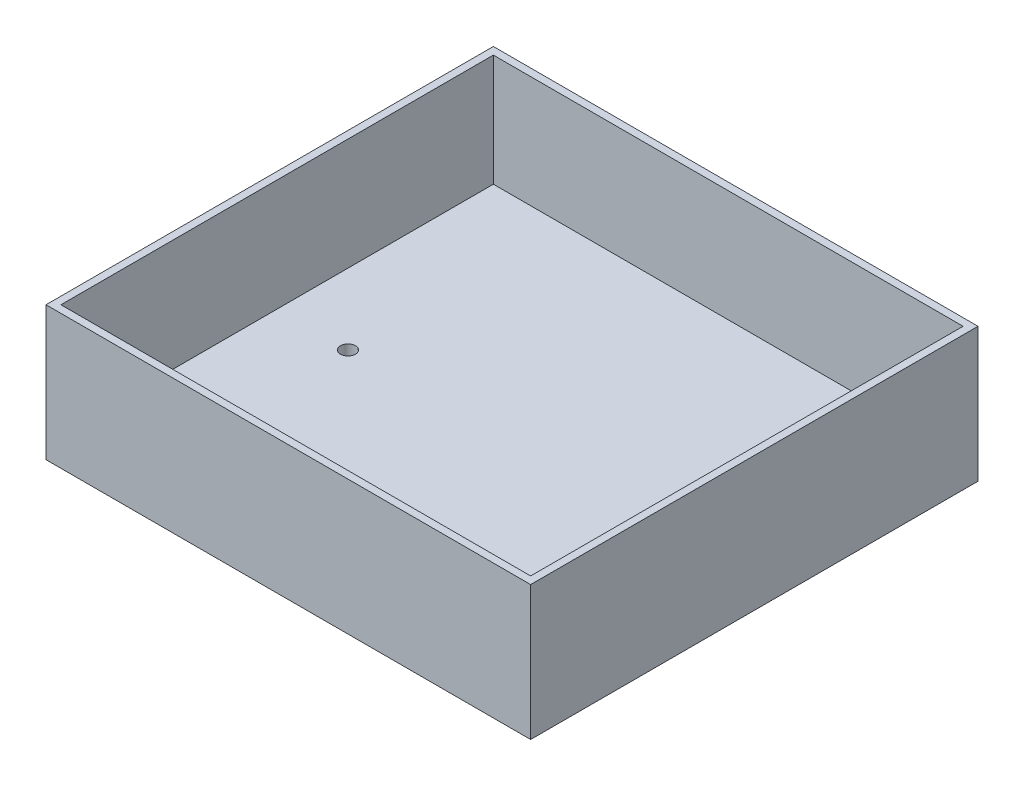
ISO-10303-21;
HEADER;
FILE_DESCRIPTION(('STEP AP214'),'2;1');
FILE_NAME('part.step','',(''),(''),'','','');
FILE_SCHEMA(('AUTOMOTIVE_DESIGN { 1 0 10303 214 1 1 1 1 }'));
ENDSEC;
DATA;
#1=APPLICATION_CONTEXT('core data for automotive mechanical design processes');
#2=APPLICATION_PROTOCOL_DEFINITION('international standard','automotive_design',2000,#1);
#3=PRODUCT_CONTEXT('',#1,'mechanical');
#4=PRODUCT('Part','Part','',(#3));
#5=PRODUCT_RELATED_PRODUCT_CATEGORY('part','',(#4));
#6=PRODUCT_DEFINITION_FORMATION('','',#4);
#7=PRODUCT_DEFINITION_CONTEXT('part definition',#1,'design');
#8=PRODUCT_DEFINITION('design','',#6,#7);
#9=PRODUCT_DEFINITION_SHAPE('','',#8);
#10=(LENGTH_UNIT() NAMED_UNIT(*) SI_UNIT(.MILLI.,.METRE.));
#11=(NAMED_UNIT(*) PLANE_ANGLE_UNIT() SI_UNIT($,.RADIAN.));
#12=(NAMED_UNIT(*) SI_UNIT($,.STERADIAN.) SOLID_ANGLE_UNIT());
#13=UNCERTAINTY_MEASURE_WITH_UNIT(LENGTH_MEASURE(1.E-05),#10,'distance_accuracy_value','');
#14=(GEOMETRIC_REPRESENTATION_CONTEXT(3) GLOBAL_UNCERTAINTY_ASSIGNED_CONTEXT((#13)) GLOBAL_UNIT_ASSIGNED_CONTEXT((#10,
#11,#12)) REPRESENTATION_CONTEXT('',''));
#15=CARTESIAN_POINT('',(0.,0.,0.));
#16=DIRECTION('',(0.,0.,1.));
#17=DIRECTION('',(1.,0.,0.));
#18=AXIS2_PLACEMENT_3D('',#15,#16,#17);
#19=CARTESIAN_POINT('',(0.,18.,0.));
#20=DIRECTION('',(0.,-1.,0.));
#21=DIRECTION('',(0.,0.,-1.));
#22=AXIS2_PLACEMENT_3D('',#19,#20,#21);
#23=PLANE('',#22);
#24=DIRECTION('',(0.,0.,1.));
#25=VECTOR('',#24,1.);
#26=CARTESIAN_POINT('',(-32.5,18.,-30.));
#27=LINE('',#26,#25);
#28=CARTESIAN_POINT('',(-32.5,18.,-30.));
#29=VERTEX_POINT('',#28);
#30=CARTESIAN_POINT('',(-32.5,18.,30.));
#31=VERTEX_POINT('',#30);
#32=EDGE_CURVE('E145',#29,#31,#27,.T.);
#33=ORIENTED_EDGE('',*,*,#32,.T.);
#34=DIRECTION('',(1.,0.,0.));
#35=VECTOR('',#34,1.);
#36=CARTESIAN_POINT('',(32.5,18.,30.));
#37=LINE('',#36,#35);
#38=CARTESIAN_POINT('',(32.5,18.,30.));
#39=VERTEX_POINT('',#38);
#40=EDGE_CURVE('E89',#31,#39,#37,.T.);
#41=ORIENTED_EDGE('',*,*,#40,.T.);
#42=DIRECTION('',(0.,0.,-1.));
#43=VECTOR('',#42,1.);
#44=CARTESIAN_POINT('',(32.5,18.,-30.));
#45=LINE('',#44,#43);
#46=CARTESIAN_POINT('',(32.5,18.,-30.));
#47=VERTEX_POINT('',#46);
#48=EDGE_CURVE('E148',#39,#47,#45,.T.);
#49=ORIENTED_EDGE('',*,*,#48,.T.);
#50=DIRECTION('',(-1.,0.,0.));
#51=VECTOR('',#50,1.);
#52=CARTESIAN_POINT('',(32.5,18.,-30.));
#53=LINE('',#52,#51);
#54=EDGE_CURVE('E61',#47,#29,#53,.T.);
#55=ORIENTED_EDGE('',*,*,#54,.T.);
#56=EDGE_LOOP('',(#33,#41,#49,#55));
#57=FACE_BOUND('',#56,.T.);
#58=DIRECTION('',(0.,0.,1.));
#59=VECTOR('',#58,1.);
#60=CARTESIAN_POINT('',(-31.5,18.,0.));
#61=LINE('',#60,#59);
#62=CARTESIAN_POINT('',(-31.5,18.,-29.));
#63=VERTEX_POINT('',#62);
#64=CARTESIAN_POINT('',(-31.5,18.,29.));
#65=VERTEX_POINT('',#64);
#66=EDGE_CURVE('E134',#63,#65,#61,.T.);
#67=ORIENTED_EDGE('',*,*,#66,.F.);
#68=DIRECTION('',(-1.,0.,0.));
#69=VECTOR('',#68,1.);
#70=CARTESIAN_POINT('',(0.,18.,-29.));
#71=LINE('',#70,#69);
#72=CARTESIAN_POINT('',(31.5,18.,-29.));
#73=VERTEX_POINT('',#72);
#74=EDGE_CURVE('E143',#73,#63,#71,.T.);
#75=ORIENTED_EDGE('',*,*,#74,.F.);
#76=DIRECTION('',(0.,0.,-1.));
#77=VECTOR('',#76,1.);
#78=CARTESIAN_POINT('',(31.5,18.,0.));
#79=LINE('',#78,#77);
#80=CARTESIAN_POINT('',(31.5,18.,29.));
#81=VERTEX_POINT('',#80);
#82=EDGE_CURVE('E141',#81,#73,#79,.T.);
#83=ORIENTED_EDGE('',*,*,#82,.F.);
#84=DIRECTION('',(1.,0.,0.));
#85=VECTOR('',#84,1.);
#86=CARTESIAN_POINT('',(0.,18.,29.));
#87=LINE('',#86,#85);
#88=EDGE_CURVE('E126',#65,#81,#87,.T.);
#89=ORIENTED_EDGE('',*,*,#88,.F.);
#90=EDGE_LOOP('',(#67,#75,#83,#89));
#91=FACE_BOUND('',#90,.T.);
#92=ADVANCED_FACE('F37',(#57,#91),#23,.F.);
#93=CARTESIAN_POINT('',(-32.5,18.,-30.));
#94=DIRECTION('',(1.,0.,0.));
#95=DIRECTION('',(0.,0.,-1.));
#96=AXIS2_PLACEMENT_3D('',#93,#94,#95);
#97=PLANE('',#96);
#98=DIRECTION('',(0.,0.,1.));
#99=VECTOR('',#98,1.);
#100=CARTESIAN_POINT('',(-32.5,0.,-30.));
#101=LINE('',#100,#99);
#102=CARTESIAN_POINT('',(-32.5,0.,-30.));
#103=VERTEX_POINT('',#102);
#104=CARTESIAN_POINT('',(-32.5,0.,30.));
#105=VERTEX_POINT('',#104);
#106=EDGE_CURVE('E152',#103,#105,#101,.T.);
#107=ORIENTED_EDGE('',*,*,#106,.T.);
#108=DIRECTION('',(0.,-1.,0.));
#109=VECTOR('',#108,1.);
#110=CARTESIAN_POINT('',(-32.5,18.,30.));
#111=LINE('',#110,#109);
#112=EDGE_CURVE('E11',#31,#105,#111,.T.);
#113=ORIENTED_EDGE('',*,*,#112,.F.);
#114=ORIENTED_EDGE('',*,*,#32,.F.);
#115=DIRECTION('',(0.,-1.,0.));
#116=VECTOR('',#115,1.);
#117=CARTESIAN_POINT('',(-32.5,18.,-30.));
#118=LINE('',#117,#116);
#119=EDGE_CURVE('E151',#29,#103,#118,.T.);
#120=ORIENTED_EDGE('',*,*,#119,.T.);
#121=EDGE_LOOP('',(#107,#113,#114,#120));
#122=FACE_BOUND('',#121,.T.);
#123=ADVANCED_FACE('F39',(#122),#97,.F.);
#124=CARTESIAN_POINT('',(32.5,18.,30.));
#125=DIRECTION('',(0.,0.,-1.));
#126=DIRECTION('',(-1.,0.,0.));
#127=AXIS2_PLACEMENT_3D('',#124,#125,#126);
#128=PLANE('',#127);
#129=DIRECTION('',(1.,0.,0.));
#130=VECTOR('',#129,1.);
#131=CARTESIAN_POINT('',(32.5,0.,30.));
#132=LINE('',#131,#130);
#133=CARTESIAN_POINT('',(32.5,0.,30.));
#134=VERTEX_POINT('',#133);
#135=EDGE_CURVE('E155',#105,#134,#132,.T.);
#136=ORIENTED_EDGE('',*,*,#135,.T.);
#137=DIRECTION('',(0.,-1.,0.));
#138=VECTOR('',#137,1.);
#139=CARTESIAN_POINT('',(32.5,18.,30.));
#140=LINE('',#139,#138);
#141=EDGE_CURVE('E45',#39,#134,#140,.T.);
#142=ORIENTED_EDGE('',*,*,#141,.F.);
#143=ORIENTED_EDGE('',*,*,#40,.F.);
#144=ORIENTED_EDGE('',*,*,#112,.T.);
#145=EDGE_LOOP('',(#136,#142,#143,#144));
#146=FACE_BOUND('',#145,.T.);
#147=ADVANCED_FACE('F184',(#146),#128,.F.);
#148=CARTESIAN_POINT('',(32.5,18.,-30.));
#149=DIRECTION('',(-1.,0.,0.));
#150=DIRECTION('',(0.,0.,1.));
#151=AXIS2_PLACEMENT_3D('',#148,#149,#150);
#152=PLANE('',#151);
#153=DIRECTION('',(0.,0.,-1.));
#154=VECTOR('',#153,1.);
#155=CARTESIAN_POINT('',(32.5,0.,-30.));
#156=LINE('',#155,#154);
#157=CARTESIAN_POINT('',(32.5,0.,-30.));
#158=VERTEX_POINT('',#157);
#159=EDGE_CURVE('E157',#134,#158,#156,.T.);
#160=ORIENTED_EDGE('',*,*,#159,.T.);
#161=DIRECTION('',(0.,-1.,0.));
#162=VECTOR('',#161,1.);
#163=CARTESIAN_POINT('',(32.5,18.,-30.));
#164=LINE('',#163,#162);
#165=EDGE_CURVE('E161',#47,#158,#164,.T.);
#166=ORIENTED_EDGE('',*,*,#165,.F.);
#167=ORIENTED_EDGE('',*,*,#48,.F.);
#168=ORIENTED_EDGE('',*,*,#141,.T.);
#169=EDGE_LOOP('',(#160,#166,#167,#168));
#170=FACE_BOUND('',#169,.T.);
#171=ADVANCED_FACE('F166',(#170),#152,.F.);
#172=CARTESIAN_POINT('',(32.5,18.,-30.));
#173=DIRECTION('',(0.,0.,1.));
#174=DIRECTION('',(1.,0.,0.));
#175=AXIS2_PLACEMENT_3D('',#172,#173,#174);
#176=PLANE('',#175);
#177=DIRECTION('',(-1.,0.,0.));
#178=VECTOR('',#177,1.);
#179=CARTESIAN_POINT('',(32.5,0.,-30.));
#180=LINE('',#179,#178);
#181=EDGE_CURVE('E82',#158,#103,#180,.T.);
#182=ORIENTED_EDGE('',*,*,#181,.T.);
#183=ORIENTED_EDGE('',*,*,#119,.F.);
#184=ORIENTED_EDGE('',*,*,#54,.F.);
#185=ORIENTED_EDGE('',*,*,#165,.T.);
#186=EDGE_LOOP('',(#182,#183,#184,#185));
#187=FACE_BOUND('',#186,.T.);
#188=ADVANCED_FACE('F174',(#187),#176,.F.);
#189=CARTESIAN_POINT('',(0.,0.,0.));
#190=DIRECTION('',(0.,-1.,0.));
#191=DIRECTION('',(0.,0.,-1.));
#192=AXIS2_PLACEMENT_3D('',#189,#190,#191);
#193=PLANE('',#192);
#194=CARTESIAN_POINT('',(-22.,0.,0.));
#195=DIRECTION('',(0.,1.,0.));
#196=DIRECTION('',(0.,0.,1.));
#197=AXIS2_PLACEMENT_3D('',#194,#195,#196);
#198=CIRCLE('',#197,1.);
#199=CARTESIAN_POINT('',(-22.,0.,1.));
#200=VERTEX_POINT('',#199);
#201=EDGE_CURVE('E218',#200,#200,#198,.T.);
#202=ORIENTED_EDGE('',*,*,#201,.T.);
#203=EDGE_LOOP('',(#202));
#204=FACE_BOUND('',#203,.T.);
#205=CARTESIAN_POINT('',(22.,0.,0.));
#206=DIRECTION('',(0.,1.,0.));
#207=DIRECTION('',(0.,0.,1.));
#208=AXIS2_PLACEMENT_3D('',#205,#206,#207);
#209=CIRCLE('',#208,1.);
#210=CARTESIAN_POINT('',(22.,0.,1.));
#211=VERTEX_POINT('',#210);
#212=EDGE_CURVE('E228',#211,#211,#209,.T.);
#213=ORIENTED_EDGE('',*,*,#212,.T.);
#214=EDGE_LOOP('',(#213));
#215=FACE_BOUND('',#214,.T.);
#216=ORIENTED_EDGE('',*,*,#106,.F.);
#217=ORIENTED_EDGE('',*,*,#181,.F.);
#218=ORIENTED_EDGE('',*,*,#159,.F.);
#219=ORIENTED_EDGE('',*,*,#135,.F.);
#220=EDGE_LOOP('',(#216,#217,#218,#219));
#221=FACE_BOUND('',#220,.T.);
#222=ADVANCED_FACE('F170',(#204,#215,#221),#193,.T.);
#223=CARTESIAN_POINT('',(-31.5,18.,-30.));
#224=DIRECTION('',(1.,0.,0.));
#225=DIRECTION('',(0.,0.,-1.));
#226=AXIS2_PLACEMENT_3D('',#223,#224,#225);
#227=PLANE('',#226);
#228=DIRECTION('',(0.,0.,1.));
#229=VECTOR('',#228,1.);
#230=CARTESIAN_POINT('',(-31.5,3.,0.));
#231=LINE('',#230,#229);
#232=CARTESIAN_POINT('',(-31.5,3.,-29.));
#233=VERTEX_POINT('',#232);
#234=CARTESIAN_POINT('',(-31.5,3.,29.));
#235=VERTEX_POINT('',#234);
#236=EDGE_CURVE('E117',#233,#235,#231,.T.);
#237=ORIENTED_EDGE('',*,*,#236,.F.);
#238=DIRECTION('',(0.,-1.,0.));
#239=VECTOR('',#238,1.);
#240=CARTESIAN_POINT('',(-31.5,18.,-29.));
#241=LINE('',#240,#239);
#242=EDGE_CURVE('E137',#63,#233,#241,.T.);
#243=ORIENTED_EDGE('',*,*,#242,.F.);
#244=ORIENTED_EDGE('',*,*,#66,.T.);
#245=DIRECTION('',(0.,-1.,0.));
#246=VECTOR('',#245,1.);
#247=CARTESIAN_POINT('',(-31.5,18.,29.));
#248=LINE('',#247,#246);
#249=EDGE_CURVE('E129',#65,#235,#248,.T.);
#250=ORIENTED_EDGE('',*,*,#249,.T.);
#251=EDGE_LOOP('',(#237,#243,#244,#250));
#252=FACE_BOUND('',#251,.T.);
#253=ADVANCED_FACE('F181',(#252),#227,.T.);
#254=CARTESIAN_POINT('',(32.5,18.,29.));
#255=DIRECTION('',(0.,0.,-1.));
#256=DIRECTION('',(-1.,0.,0.));
#257=AXIS2_PLACEMENT_3D('',#254,#255,#256);
#258=PLANE('',#257);
#259=DIRECTION('',(1.,0.,0.));
#260=VECTOR('',#259,1.);
#261=CARTESIAN_POINT('',(0.,3.,29.));
#262=LINE('',#261,#260);
#263=CARTESIAN_POINT('',(31.5,3.,29.));
#264=VERTEX_POINT('',#263);
#265=EDGE_CURVE('E111',#235,#264,#262,.T.);
#266=ORIENTED_EDGE('',*,*,#265,.F.);
#267=ORIENTED_EDGE('',*,*,#249,.F.);
#268=ORIENTED_EDGE('',*,*,#88,.T.);
#269=DIRECTION('',(0.,-1.,0.));
#270=VECTOR('',#269,1.);
#271=CARTESIAN_POINT('',(31.5,18.,29.));
#272=LINE('',#271,#270);
#273=EDGE_CURVE('E123',#81,#264,#272,.T.);
#274=ORIENTED_EDGE('',*,*,#273,.T.);
#275=EDGE_LOOP('',(#266,#267,#268,#274));
#276=FACE_BOUND('',#275,.T.);
#277=ADVANCED_FACE('F124',(#276),#258,.T.);
#278=CARTESIAN_POINT('',(31.5,18.,-30.));
#279=DIRECTION('',(-1.,0.,0.));
#280=DIRECTION('',(0.,0.,1.));
#281=AXIS2_PLACEMENT_3D('',#278,#279,#280);
#282=PLANE('',#281);
#283=DIRECTION('',(0.,0.,-1.));
#284=VECTOR('',#283,1.);
#285=CARTESIAN_POINT('',(31.5,3.,0.));
#286=LINE('',#285,#284);
#287=CARTESIAN_POINT('',(31.5,3.,-29.));
#288=VERTEX_POINT('',#287);
#289=EDGE_CURVE('E115',#264,#288,#286,.T.);
#290=ORIENTED_EDGE('',*,*,#289,.F.);
#291=ORIENTED_EDGE('',*,*,#273,.F.);
#292=ORIENTED_EDGE('',*,*,#82,.T.);
#293=DIRECTION('',(0.,-1.,0.));
#294=VECTOR('',#293,1.);
#295=CARTESIAN_POINT('',(31.5,18.,-29.));
#296=LINE('',#295,#294);
#297=EDGE_CURVE('E52',#73,#288,#296,.T.);
#298=ORIENTED_EDGE('',*,*,#297,.T.);
#299=EDGE_LOOP('',(#290,#291,#292,#298));
#300=FACE_BOUND('',#299,.T.);
#301=ADVANCED_FACE('F131',(#300),#282,.T.);
#302=CARTESIAN_POINT('',(32.5,18.,-29.));
#303=DIRECTION('',(0.,0.,1.));
#304=DIRECTION('',(1.,0.,0.));
#305=AXIS2_PLACEMENT_3D('',#302,#303,#304);
#306=PLANE('',#305);
#307=DIRECTION('',(-1.,0.,0.));
#308=VECTOR('',#307,1.);
#309=CARTESIAN_POINT('',(0.,3.,-29.));
#310=LINE('',#309,#308);
#311=EDGE_CURVE('E132',#288,#233,#310,.T.);
#312=ORIENTED_EDGE('',*,*,#311,.F.);
#313=ORIENTED_EDGE('',*,*,#297,.F.);
#314=ORIENTED_EDGE('',*,*,#74,.T.);
#315=ORIENTED_EDGE('',*,*,#242,.T.);
#316=EDGE_LOOP('',(#312,#313,#314,#315));
#317=FACE_BOUND('',#316,.T.);
#318=ADVANCED_FACE('F196',(#317),#306,.T.);
#319=CARTESIAN_POINT('',(0.,3.,0.));
#320=DIRECTION('',(0.,-1.,0.));
#321=DIRECTION('',(0.,0.,-1.));
#322=AXIS2_PLACEMENT_3D('',#319,#320,#321);
#323=PLANE('',#322);
#324=CARTESIAN_POINT('',(-22.,3.,0.));
#325=DIRECTION('',(0.,1.,0.));
#326=DIRECTION('',(0.,0.,1.));
#327=AXIS2_PLACEMENT_3D('',#324,#325,#326);
#328=CIRCLE('',#327,1.);
#329=CARTESIAN_POINT('',(-22.,3.,1.));
#330=VERTEX_POINT('',#329);
#331=EDGE_CURVE('E221',#330,#330,#328,.T.);
#332=ORIENTED_EDGE('',*,*,#331,.F.);
#333=EDGE_LOOP('',(#332));
#334=FACE_BOUND('',#333,.T.);
#335=CARTESIAN_POINT('',(22.,3.,0.));
#336=DIRECTION('',(0.,1.,0.));
#337=DIRECTION('',(0.,0.,1.));
#338=AXIS2_PLACEMENT_3D('',#335,#336,#337);
#339=CIRCLE('',#338,1.);
#340=CARTESIAN_POINT('',(22.,3.,1.));
#341=VERTEX_POINT('',#340);
#342=EDGE_CURVE('E223',#341,#341,#339,.T.);
#343=ORIENTED_EDGE('',*,*,#342,.F.);
#344=EDGE_LOOP('',(#343));
#345=FACE_BOUND('',#344,.T.);
#346=ORIENTED_EDGE('',*,*,#236,.T.);
#347=ORIENTED_EDGE('',*,*,#265,.T.);
#348=ORIENTED_EDGE('',*,*,#289,.T.);
#349=ORIENTED_EDGE('',*,*,#311,.T.);
#350=EDGE_LOOP('',(#346,#347,#348,#349));
#351=FACE_BOUND('',#350,.T.);
#352=ADVANCED_FACE('F113',(#334,#345,#351),#323,.F.);
#353=CARTESIAN_POINT('',(22.,3.,0.));
#354=DIRECTION('',(0.,1.,0.));
#355=DIRECTION('',(0.,0.,1.));
#356=AXIS2_PLACEMENT_3D('',#353,#354,#355);
#357=CYLINDRICAL_SURFACE('',#356,1.);
#358=ORIENTED_EDGE('',*,*,#212,.F.);
#359=EDGE_LOOP('',(#358));
#360=FACE_BOUND('',#359,.T.);
#361=ORIENTED_EDGE('',*,*,#342,.T.);
#362=EDGE_LOOP('',(#361));
#363=FACE_BOUND('',#362,.T.);
#364=ADVANCED_FACE('F195',(#360,#363),#357,.F.);
#365=CARTESIAN_POINT('',(-22.,3.,0.));
#366=DIRECTION('',(0.,1.,0.));
#367=DIRECTION('',(0.,0.,1.));
#368=AXIS2_PLACEMENT_3D('',#365,#366,#367);
#369=CYLINDRICAL_SURFACE('',#368,1.);
#370=ORIENTED_EDGE('',*,*,#201,.F.);
#371=EDGE_LOOP('',(#370));
#372=FACE_BOUND('',#371,.T.);
#373=ORIENTED_EDGE('',*,*,#331,.T.);
#374=EDGE_LOOP('',(#373));
#375=FACE_BOUND('',#374,.T.);
#376=ADVANCED_FACE('F209',(#372,#375),#369,.F.);
#377=CLOSED_SHELL('',(#92,#123,#147,#171,#188,#222,#253,#277,#301,#318,#352,#364,#376));
#378=MANIFOLD_SOLID_BREP('B2',#377);
#379=ADVANCED_BREP_SHAPE_REPRESENTATION('',(#18,#378),#14);
#380=SHAPE_DEFINITION_REPRESENTATION(#9,#379);
ENDSEC;
END-ISO-10303-21;
